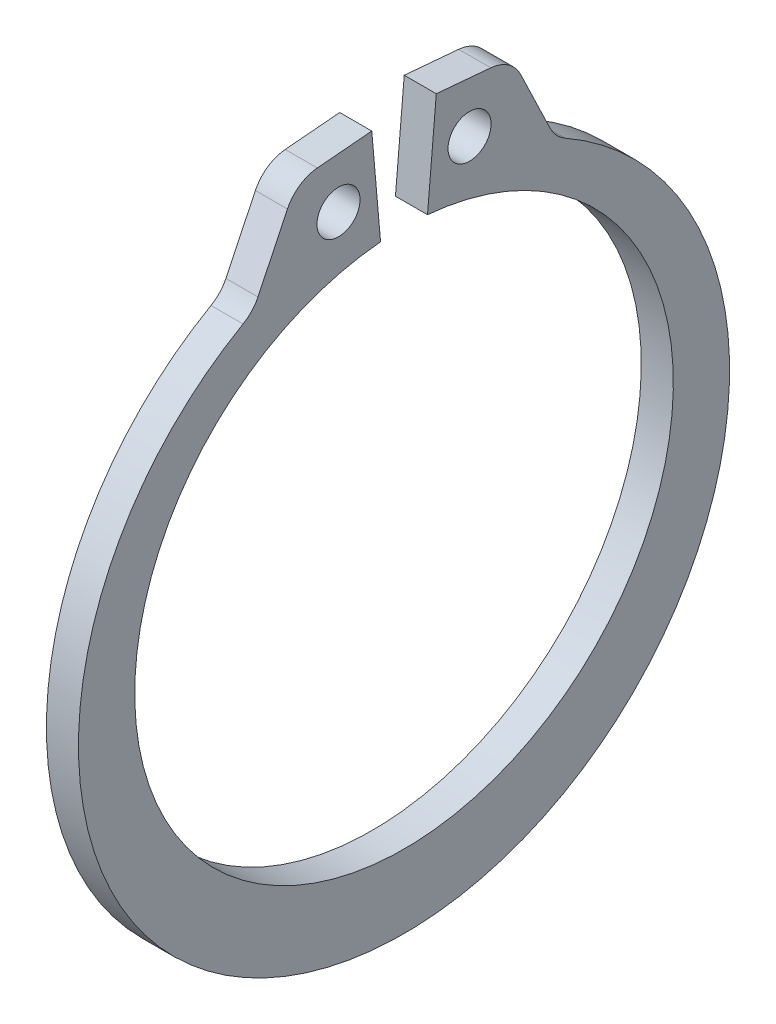
ISO-10303-21;
HEADER;
FILE_DESCRIPTION(('STEP AP214'),'2;1');
FILE_NAME('part.step','',(''),(''),'','','');
FILE_SCHEMA(('AUTOMOTIVE_DESIGN { 1 0 10303 214 1 1 1 1 }'));
ENDSEC;
DATA;
#1=APPLICATION_CONTEXT('core data for automotive mechanical design processes');
#2=APPLICATION_PROTOCOL_DEFINITION('international standard','automotive_design',2000,#1);
#3=PRODUCT_CONTEXT('',#1,'mechanical');
#4=PRODUCT('Part','Part','',(#3));
#5=PRODUCT_RELATED_PRODUCT_CATEGORY('part','',(#4));
#6=PRODUCT_DEFINITION_FORMATION('','',#4);
#7=PRODUCT_DEFINITION_CONTEXT('part definition',#1,'design');
#8=PRODUCT_DEFINITION('design','',#6,#7);
#9=PRODUCT_DEFINITION_SHAPE('','',#8);
#10=(LENGTH_UNIT() NAMED_UNIT(*) SI_UNIT(.MILLI.,.METRE.));
#11=(NAMED_UNIT(*) PLANE_ANGLE_UNIT() SI_UNIT($,.RADIAN.));
#12=(NAMED_UNIT(*) SI_UNIT($,.STERADIAN.) SOLID_ANGLE_UNIT());
#13=UNCERTAINTY_MEASURE_WITH_UNIT(LENGTH_MEASURE(1.E-05),#10,'distance_accuracy_value','');
#14=(GEOMETRIC_REPRESENTATION_CONTEXT(3) GLOBAL_UNCERTAINTY_ASSIGNED_CONTEXT((#13)) GLOBAL_UNIT_ASSIGNED_CONTEXT((#10,
#11,#12)) REPRESENTATION_CONTEXT('',''));
#15=CARTESIAN_POINT('',(0.,0.,0.));
#16=DIRECTION('',(0.,0.,1.));
#17=DIRECTION('',(1.,0.,0.));
#18=AXIS2_PLACEMENT_3D('',#15,#16,#17);
#19=CARTESIAN_POINT('',(0.4445,0.,0.));
#20=DIRECTION('',(1.,0.,0.));
#21=DIRECTION('',(0.,0.,-1.));
#22=AXIS2_PLACEMENT_3D('',#19,#20,#21);
#23=PLANE('',#22);
#24=CARTESIAN_POINT('',(0.4445,8.73955009124023,1.81636379208652));
#25=DIRECTION('',(1.,0.,0.));
#26=DIRECTION('',(0.,0.,-1.));
#27=AXIS2_PLACEMENT_3D('',#24,#25,#26);
#28=CIRCLE('',#27,0.5969);
#29=CARTESIAN_POINT('',(0.4445,8.73955009124023,1.21946379208652));
#30=VERTEX_POINT('',#29);
#31=EDGE_CURVE('E221',#30,#30,#28,.T.);
#32=ORIENTED_EDGE('',*,*,#31,.F.);
#33=EDGE_LOOP('',(#32));
#34=FACE_BOUND('',#33,.T.);
#35=DIRECTION('',(0.,-0.0871557427476592,0.996194698091746));
#36=VECTOR('',#35,1.);
#37=CARTESIAN_POINT('',(0.4445,10.2225515139383,0.894357369779371));
#38=LINE('',#37,#36);
#39=CARTESIAN_POINT('',(0.4445,10.2225515139383,0.894357369779371));
#40=VERTEX_POINT('',#39);
#41=CARTESIAN_POINT('',(0.4445,10.0903647104024,2.40525944792902));
#42=VERTEX_POINT('',#41);
#43=EDGE_CURVE('E133',#40,#42,#38,.T.);
#44=ORIENTED_EDGE('',*,*,#43,.T.);
#45=CARTESIAN_POINT('',(0.4445,9.07823089714119,2.3167092132974));
#46=DIRECTION('',(1.,0.,0.));
#47=DIRECTION('',(0.,0.,-1.));
#48=AXIS2_PLACEMENT_3D('',#45,#46,#47);
#49=CIRCLE('',#48,1.016);
#50=CARTESIAN_POINT('',(0.4445,9.51816860415807,3.23252077357862));
#51=VERTEX_POINT('',#50);
#52=EDGE_CURVE('E174',#42,#51,#49,.T.);
#53=ORIENTED_EDGE('',*,*,#52,.T.);
#54=DIRECTION('',(0.,-0.901389330985454,0.433009554150479));
#55=VECTOR('',#54,1.);
#56=CARTESIAN_POINT('',(0.4445,10.0399166550105,2.98188335963062));
#57=LINE('',#56,#55);
#58=CARTESIAN_POINT('',(0.4445,7.81601834853871,4.05019999158875));
#59=VERTEX_POINT('',#58);
#60=EDGE_CURVE('E213',#51,#59,#57,.T.);
#61=ORIENTED_EDGE('',*,*,#60,.T.);
#62=CARTESIAN_POINT('',(0.4445,8.2559560555556,4.96601155186998));
#63=DIRECTION('',(1.,0.,0.));
#64=DIRECTION('',(0.,0.,-1.));
#65=AXIS2_PLACEMENT_3D('',#62,#63,#64);
#66=CIRCLE('',#65,1.016);
#67=CARTESIAN_POINT('',(0.4445,7.37286685370435,4.46360786799244));
#68=VERTEX_POINT('',#67);
#69=EDGE_CURVE('E181',#59,#68,#66,.F.);
#70=ORIENTED_EDGE('',*,*,#69,.T.);
#71=CARTESIAN_POINT('',(0.4445,-0.472943270735776,0.));
#72=DIRECTION('',(1.,0.,0.));
#73=DIRECTION('',(0.,0.,-1.));
#74=AXIS2_PLACEMENT_3D('',#71,#72,#73);
#75=CIRCLE('',#74,9.02665672926423);
#76=CARTESIAN_POINT('',(0.4445,7.37286685370435,-4.46360786799244));
#77=VERTEX_POINT('',#76);
#78=EDGE_CURVE('E206',#68,#77,#75,.T.);
#79=ORIENTED_EDGE('',*,*,#78,.T.);
#80=CARTESIAN_POINT('',(0.4445,8.2559560555556,-4.96601155186998));
#81=DIRECTION('',(1.,0.,0.));
#82=DIRECTION('',(0.,0.,-1.));
#83=AXIS2_PLACEMENT_3D('',#80,#81,#82);
#84=CIRCLE('',#83,1.016);
#85=CARTESIAN_POINT('',(0.4445,7.81601834853871,-4.05019999158875));
#86=VERTEX_POINT('',#85);
#87=EDGE_CURVE('E11',#77,#86,#84,.F.);
#88=ORIENTED_EDGE('',*,*,#87,.T.);
#89=DIRECTION('',(0.,0.901389330985454,0.433009554150479));
#90=VECTOR('',#89,1.);
#91=CARTESIAN_POINT('',(0.4445,10.0399166550105,-2.98188335963062));
#92=LINE('',#91,#90);
#93=CARTESIAN_POINT('',(0.4445,9.51816860415807,-3.23252077357862));
#94=VERTEX_POINT('',#93);
#95=EDGE_CURVE('E205',#86,#94,#92,.T.);
#96=ORIENTED_EDGE('',*,*,#95,.T.);
#97=CARTESIAN_POINT('',(0.4445,9.07823089714119,-2.3167092132974));
#98=DIRECTION('',(1.,0.,0.));
#99=DIRECTION('',(0.,0.,-1.));
#100=AXIS2_PLACEMENT_3D('',#97,#98,#99);
#101=CIRCLE('',#100,1.016);
#102=CARTESIAN_POINT('',(0.4445,10.0903647104024,-2.40525944792902));
#103=VERTEX_POINT('',#102);
#104=EDGE_CURVE('E49',#94,#103,#101,.T.);
#105=ORIENTED_EDGE('',*,*,#104,.T.);
#106=DIRECTION('',(0.,0.0871557427476592,0.996194698091746));
#107=VECTOR('',#106,1.);
#108=CARTESIAN_POINT('',(0.4445,10.2225515139383,-0.894357369779371));
#109=LINE('',#108,#107);
#110=CARTESIAN_POINT('',(0.4445,10.2225515139383,-0.894357369779371));
#111=VERTEX_POINT('',#110);
#112=EDGE_CURVE('E210',#103,#111,#109,.T.);
#113=ORIENTED_EDGE('',*,*,#112,.T.);
#114=DIRECTION('',(0.,-0.996194698091746,0.0871557427476584));
#115=VECTOR('',#114,1.);
#116=CARTESIAN_POINT('',(0.4445,7.43918352746992,-0.650844224542414));
#117=LINE('',#116,#115);
#118=CARTESIAN_POINT('',(0.4445,7.43918352746992,-0.650844224542414));
#119=VERTEX_POINT('',#118);
#120=EDGE_CURVE('E139',#111,#119,#117,.T.);
#121=ORIENTED_EDGE('',*,*,#120,.T.);
#122=CARTESIAN_POINT('',(0.4445,0.,0.));
#123=DIRECTION('',(-1.,0.,0.));
#124=DIRECTION('',(0.,0.,-1.));
#125=AXIS2_PLACEMENT_3D('',#122,#123,#124);
#126=CIRCLE('',#125,7.4676);
#127=CARTESIAN_POINT('',(0.4445,7.43918352746992,0.650844224542414));
#128=VERTEX_POINT('',#127);
#129=EDGE_CURVE('E134',#119,#128,#126,.T.);
#130=ORIENTED_EDGE('',*,*,#129,.T.);
#131=DIRECTION('',(0.,0.996194698091746,0.0871557427476584));
#132=VECTOR('',#131,1.);
#133=CARTESIAN_POINT('',(0.4445,7.43918352746992,0.650844224542414));
#134=LINE('',#133,#132);
#135=EDGE_CURVE('E125',#128,#40,#134,.T.);
#136=ORIENTED_EDGE('',*,*,#135,.T.);
#137=EDGE_LOOP('',(#44,#53,#61,#70,#79,#88,#96,#105,#113,#121,#130,#136));
#138=FACE_BOUND('',#137,.T.);
#139=CARTESIAN_POINT('',(0.4445,8.73955009124023,-1.81636379208652));
#140=DIRECTION('',(1.,0.,0.));
#141=DIRECTION('',(0.,0.,-1.));
#142=AXIS2_PLACEMENT_3D('',#139,#140,#141);
#143=CIRCLE('',#142,0.5969);
#144=CARTESIAN_POINT('',(0.4445,8.73955009124023,-2.41326379208652));
#145=VERTEX_POINT('',#144);
#146=EDGE_CURVE('E247',#145,#145,#143,.T.);
#147=ORIENTED_EDGE('',*,*,#146,.F.);
#148=EDGE_LOOP('',(#147));
#149=FACE_BOUND('',#148,.T.);
#150=ADVANCED_FACE('F34',(#34,#138,#149),#23,.T.);
#151=CARTESIAN_POINT('',(-0.4445,0.,0.));
#152=DIRECTION('',(1.,0.,0.));
#153=DIRECTION('',(0.,0.,-1.));
#154=AXIS2_PLACEMENT_3D('',#151,#152,#153);
#155=PLANE('',#154);
#156=DIRECTION('',(0.,-0.901389330985454,0.433009554150479));
#157=VECTOR('',#156,1.);
#158=CARTESIAN_POINT('',(-0.4445,10.0399166550105,2.98188335963062));
#159=LINE('',#158,#157);
#160=CARTESIAN_POINT('',(-0.4445,9.51816860415807,3.23252077357862));
#161=VERTEX_POINT('',#160);
#162=CARTESIAN_POINT('',(-0.4445,7.81601834853871,4.05019999158875));
#163=VERTEX_POINT('',#162);
#164=EDGE_CURVE('E200',#161,#163,#159,.T.);
#165=ORIENTED_EDGE('',*,*,#164,.F.);
#166=CARTESIAN_POINT('',(-0.4445,9.07823089714119,2.3167092132974));
#167=DIRECTION('',(1.,0.,0.));
#168=DIRECTION('',(0.,0.,-1.));
#169=AXIS2_PLACEMENT_3D('',#166,#167,#168);
#170=CIRCLE('',#169,1.016);
#171=CARTESIAN_POINT('',(-0.4445,10.0903647104024,2.40525944792902));
#172=VERTEX_POINT('',#171);
#173=EDGE_CURVE('E170',#161,#172,#170,.F.);
#174=ORIENTED_EDGE('',*,*,#173,.T.);
#175=DIRECTION('',(0.,-0.0871557427476592,0.996194698091746));
#176=VECTOR('',#175,1.);
#177=CARTESIAN_POINT('',(-0.4445,10.2225515139383,0.894357369779371));
#178=LINE('',#177,#176);
#179=CARTESIAN_POINT('',(-0.4445,10.2225515139383,0.894357369779371));
#180=VERTEX_POINT('',#179);
#181=EDGE_CURVE('E223',#180,#172,#178,.T.);
#182=ORIENTED_EDGE('',*,*,#181,.F.);
#183=DIRECTION('',(0.,0.996194698091746,0.0871557427476584));
#184=VECTOR('',#183,1.);
#185=CARTESIAN_POINT('',(-0.4445,7.43918352746992,0.650844224542414));
#186=LINE('',#185,#184);
#187=CARTESIAN_POINT('',(-0.4445,7.43918352746992,0.650844224542414));
#188=VERTEX_POINT('',#187);
#189=EDGE_CURVE('E220',#188,#180,#186,.T.);
#190=ORIENTED_EDGE('',*,*,#189,.F.);
#191=CARTESIAN_POINT('',(-0.4445,0.,0.));
#192=DIRECTION('',(-1.,0.,0.));
#193=DIRECTION('',(0.,0.,-1.));
#194=AXIS2_PLACEMENT_3D('',#191,#192,#193);
#195=CIRCLE('',#194,7.4676);
#196=CARTESIAN_POINT('',(-0.4445,7.43918352746992,-0.650844224542414));
#197=VERTEX_POINT('',#196);
#198=EDGE_CURVE('E147',#197,#188,#195,.T.);
#199=ORIENTED_EDGE('',*,*,#198,.F.);
#200=DIRECTION('',(0.,-0.996194698091746,0.0871557427476584));
#201=VECTOR('',#200,1.);
#202=CARTESIAN_POINT('',(-0.4445,7.43918352746992,-0.650844224542414));
#203=LINE('',#202,#201);
#204=CARTESIAN_POINT('',(-0.4445,10.2225515139383,-0.894357369779371));
#205=VERTEX_POINT('',#204);
#206=EDGE_CURVE('E143',#205,#197,#203,.T.);
#207=ORIENTED_EDGE('',*,*,#206,.F.);
#208=DIRECTION('',(0.,0.0871557427476592,0.996194698091746));
#209=VECTOR('',#208,1.);
#210=CARTESIAN_POINT('',(-0.4445,10.2225515139383,-0.894357369779371));
#211=LINE('',#210,#209);
#212=CARTESIAN_POINT('',(-0.4445,10.0903647104024,-2.40525944792902));
#213=VERTEX_POINT('',#212);
#214=EDGE_CURVE('E228',#213,#205,#211,.T.);
#215=ORIENTED_EDGE('',*,*,#214,.F.);
#216=CARTESIAN_POINT('',(-0.4445,9.07823089714119,-2.3167092132974));
#217=DIRECTION('',(1.,0.,0.));
#218=DIRECTION('',(0.,0.,-1.));
#219=AXIS2_PLACEMENT_3D('',#216,#217,#218);
#220=CIRCLE('',#219,1.016);
#221=CARTESIAN_POINT('',(-0.4445,9.51816860415807,-3.23252077357862));
#222=VERTEX_POINT('',#221);
#223=EDGE_CURVE('E168',#213,#222,#220,.F.);
#224=ORIENTED_EDGE('',*,*,#223,.T.);
#225=DIRECTION('',(0.,0.901389330985454,0.433009554150479));
#226=VECTOR('',#225,1.);
#227=CARTESIAN_POINT('',(-0.4445,10.0399166550105,-2.98188335963062));
#228=LINE('',#227,#226);
#229=CARTESIAN_POINT('',(-0.4445,7.81601834853871,-4.05019999158875));
#230=VERTEX_POINT('',#229);
#231=EDGE_CURVE('E191',#230,#222,#228,.T.);
#232=ORIENTED_EDGE('',*,*,#231,.F.);
#233=CARTESIAN_POINT('',(-0.4445,8.2559560555556,-4.96601155186998));
#234=DIRECTION('',(1.,0.,0.));
#235=DIRECTION('',(0.,0.,-1.));
#236=AXIS2_PLACEMENT_3D('',#233,#234,#235);
#237=CIRCLE('',#236,1.016);
#238=CARTESIAN_POINT('',(-0.4445,7.37286685370435,-4.46360786799244));
#239=VERTEX_POINT('',#238);
#240=EDGE_CURVE('E42',#230,#239,#237,.T.);
#241=ORIENTED_EDGE('',*,*,#240,.T.);
#242=CARTESIAN_POINT('',(-0.4445,-0.472943270735776,0.));
#243=DIRECTION('',(1.,0.,0.));
#244=DIRECTION('',(0.,0.,-1.));
#245=AXIS2_PLACEMENT_3D('',#242,#243,#244);
#246=CIRCLE('',#245,9.02665672926423);
#247=CARTESIAN_POINT('',(-0.4445,7.37286685370435,4.46360786799244));
#248=VERTEX_POINT('',#247);
#249=EDGE_CURVE('E189',#248,#239,#246,.T.);
#250=ORIENTED_EDGE('',*,*,#249,.F.);
#251=CARTESIAN_POINT('',(-0.4445,8.2559560555556,4.96601155186998));
#252=DIRECTION('',(1.,0.,0.));
#253=DIRECTION('',(0.,0.,-1.));
#254=AXIS2_PLACEMENT_3D('',#251,#252,#253);
#255=CIRCLE('',#254,1.016);
#256=EDGE_CURVE('E179',#248,#163,#255,.T.);
#257=ORIENTED_EDGE('',*,*,#256,.T.);
#258=EDGE_LOOP('',(#165,#174,#182,#190,#199,#207,#215,#224,#232,#241,#250,#257));
#259=FACE_BOUND('',#258,.T.);
#260=CARTESIAN_POINT('',(-0.4445,8.73955009124023,1.81636379208652));
#261=DIRECTION('',(1.,0.,0.));
#262=DIRECTION('',(0.,0.,-1.));
#263=AXIS2_PLACEMENT_3D('',#260,#261,#262);
#264=CIRCLE('',#263,0.5969);
#265=CARTESIAN_POINT('',(-0.4445,8.73955009124023,1.21946379208652));
#266=VERTEX_POINT('',#265);
#267=EDGE_CURVE('E244',#266,#266,#264,.T.);
#268=ORIENTED_EDGE('',*,*,#267,.T.);
#269=EDGE_LOOP('',(#268));
#270=FACE_BOUND('',#269,.T.);
#271=CARTESIAN_POINT('',(-0.4445,8.73955009124023,-1.81636379208652));
#272=DIRECTION('',(1.,0.,0.));
#273=DIRECTION('',(0.,0.,-1.));
#274=AXIS2_PLACEMENT_3D('',#271,#272,#273);
#275=CIRCLE('',#274,0.5969);
#276=CARTESIAN_POINT('',(-0.4445,8.73955009124023,-2.41326379208652));
#277=VERTEX_POINT('',#276);
#278=EDGE_CURVE('E250',#277,#277,#275,.T.);
#279=ORIENTED_EDGE('',*,*,#278,.T.);
#280=EDGE_LOOP('',(#279));
#281=FACE_BOUND('',#280,.T.);
#282=ADVANCED_FACE('F187',(#259,#270,#281),#155,.F.);
#283=CARTESIAN_POINT('',(0.4445,0.,0.));
#284=DIRECTION('',(-1.,0.,0.));
#285=DIRECTION('',(0.,0.,1.));
#286=AXIS2_PLACEMENT_3D('',#283,#284,#285);
#287=CYLINDRICAL_SURFACE('',#286,7.4676);
#288=ORIENTED_EDGE('',*,*,#198,.T.);
#289=DIRECTION('',(-1.,0.,0.));
#290=VECTOR('',#289,1.);
#291=CARTESIAN_POINT('',(0.4445,7.43918352746992,0.650844224542414));
#292=LINE('',#291,#290);
#293=EDGE_CURVE('E129',#128,#188,#292,.T.);
#294=ORIENTED_EDGE('',*,*,#293,.F.);
#295=ORIENTED_EDGE('',*,*,#129,.F.);
#296=DIRECTION('',(-1.,0.,0.));
#297=VECTOR('',#296,1.);
#298=CARTESIAN_POINT('',(0.4445,7.43918352746992,-0.650844224542414));
#299=LINE('',#298,#297);
#300=EDGE_CURVE('E218',#119,#197,#299,.T.);
#301=ORIENTED_EDGE('',*,*,#300,.T.);
#302=EDGE_LOOP('',(#288,#294,#295,#301));
#303=FACE_BOUND('',#302,.T.);
#304=ADVANCED_FACE('F145',(#303),#287,.F.);
#305=CARTESIAN_POINT('',(0.4445,7.43918352746992,0.650844224542414));
#306=DIRECTION('',(0.,-0.0871557427476584,0.996194698091746));
#307=DIRECTION('',(0.,-0.996194698091746,-0.0871557427476584));
#308=AXIS2_PLACEMENT_3D('',#305,#306,#307);
#309=PLANE('',#308);
#310=ORIENTED_EDGE('',*,*,#189,.T.);
#311=DIRECTION('',(-1.,0.,0.));
#312=VECTOR('',#311,1.);
#313=CARTESIAN_POINT('',(0.4445,10.2225515139383,0.894357369779371));
#314=LINE('',#313,#312);
#315=EDGE_CURVE('E132',#40,#180,#314,.T.);
#316=ORIENTED_EDGE('',*,*,#315,.F.);
#317=ORIENTED_EDGE('',*,*,#135,.F.);
#318=ORIENTED_EDGE('',*,*,#293,.T.);
#319=EDGE_LOOP('',(#310,#316,#317,#318));
#320=FACE_BOUND('',#319,.T.);
#321=ADVANCED_FACE('F127',(#320),#309,.F.);
#322=CARTESIAN_POINT('',(0.4445,10.2225515139383,0.894357369779371));
#323=DIRECTION('',(0.,-0.996194698091746,-0.0871557427476592));
#324=DIRECTION('',(0.,0.0871557427476592,-0.996194698091746));
#325=AXIS2_PLACEMENT_3D('',#322,#323,#324);
#326=PLANE('',#325);
#327=ORIENTED_EDGE('',*,*,#181,.T.);
#328=DIRECTION('',(-1.,0.,0.));
#329=VECTOR('',#328,1.);
#330=CARTESIAN_POINT('',(0.4445,10.0903647104024,2.40525944792902));
#331=LINE('',#330,#329);
#332=EDGE_CURVE('E57',#172,#42,#331,.F.);
#333=ORIENTED_EDGE('',*,*,#332,.T.);
#334=ORIENTED_EDGE('',*,*,#43,.F.);
#335=ORIENTED_EDGE('',*,*,#315,.T.);
#336=EDGE_LOOP('',(#327,#333,#334,#335));
#337=FACE_BOUND('',#336,.T.);
#338=ADVANCED_FACE('F239',(#337),#326,.F.);
#339=CARTESIAN_POINT('',(0.4445,10.0399166550105,2.98188335963062));
#340=DIRECTION('',(0.,-0.433009554150479,-0.901389330985454));
#341=DIRECTION('',(0.,0.901389330985454,-0.433009554150479));
#342=AXIS2_PLACEMENT_3D('',#339,#340,#341);
#343=PLANE('',#342);
#344=ORIENTED_EDGE('',*,*,#164,.T.);
#345=DIRECTION('',(1.,0.,0.));
#346=VECTOR('',#345,1.);
#347=CARTESIAN_POINT('',(0.4445,7.81601834853871,4.05019999158875));
#348=LINE('',#347,#346);
#349=EDGE_CURVE('E161',#163,#59,#348,.T.);
#350=ORIENTED_EDGE('',*,*,#349,.T.);
#351=ORIENTED_EDGE('',*,*,#60,.F.);
#352=DIRECTION('',(-1.,0.,0.));
#353=VECTOR('',#352,1.);
#354=CARTESIAN_POINT('',(0.4445,9.51816860415807,3.23252077357862));
#355=LINE('',#354,#353);
#356=EDGE_CURVE('E158',#51,#161,#355,.T.);
#357=ORIENTED_EDGE('',*,*,#356,.T.);
#358=EDGE_LOOP('',(#344,#350,#351,#357));
#359=FACE_BOUND('',#358,.T.);
#360=ADVANCED_FACE('F279',(#359),#343,.F.);
#361=CARTESIAN_POINT('',(0.4445,-0.472943270735776,0.));
#362=DIRECTION('',(-1.,0.,0.));
#363=DIRECTION('',(0.,0.,1.));
#364=AXIS2_PLACEMENT_3D('',#361,#362,#363);
#365=CYLINDRICAL_SURFACE('',#364,9.02665672926423);
#366=ORIENTED_EDGE('',*,*,#78,.F.);
#367=DIRECTION('',(-1.,0.,0.));
#368=VECTOR('',#367,1.);
#369=CARTESIAN_POINT('',(0.4445,7.37286685370435,4.46360786799244));
#370=LINE('',#369,#368);
#371=EDGE_CURVE('E150',#68,#248,#370,.T.);
#372=ORIENTED_EDGE('',*,*,#371,.T.);
#373=ORIENTED_EDGE('',*,*,#249,.T.);
#374=DIRECTION('',(-1.,0.,0.));
#375=VECTOR('',#374,1.);
#376=CARTESIAN_POINT('',(0.4445,7.37286685370435,-4.46360786799244));
#377=LINE('',#376,#375);
#378=EDGE_CURVE('E148',#239,#77,#377,.F.);
#379=ORIENTED_EDGE('',*,*,#378,.T.);
#380=EDGE_LOOP('',(#366,#372,#373,#379));
#381=FACE_BOUND('',#380,.T.);
#382=ADVANCED_FACE('F197',(#381),#365,.T.);
#383=CARTESIAN_POINT('',(0.4445,10.0399166550105,-2.98188335963062));
#384=DIRECTION('',(0.,-0.433009554150479,0.901389330985454));
#385=DIRECTION('',(0.,-0.901389330985454,-0.433009554150479));
#386=AXIS2_PLACEMENT_3D('',#383,#384,#385);
#387=PLANE('',#386);
#388=ORIENTED_EDGE('',*,*,#95,.F.);
#389=DIRECTION('',(1.,0.,0.));
#390=VECTOR('',#389,1.);
#391=CARTESIAN_POINT('',(-0.4445,7.81601834853871,-4.05019999158875));
#392=LINE('',#391,#390);
#393=EDGE_CURVE('E165',#86,#230,#392,.F.);
#394=ORIENTED_EDGE('',*,*,#393,.T.);
#395=ORIENTED_EDGE('',*,*,#231,.T.);
#396=DIRECTION('',(-1.,0.,0.));
#397=VECTOR('',#396,1.);
#398=CARTESIAN_POINT('',(0.4445,9.51816860415807,-3.23252077357862));
#399=LINE('',#398,#397);
#400=EDGE_CURVE('E163',#222,#94,#399,.F.);
#401=ORIENTED_EDGE('',*,*,#400,.T.);
#402=EDGE_LOOP('',(#388,#394,#395,#401));
#403=FACE_BOUND('',#402,.T.);
#404=ADVANCED_FACE('F208',(#403),#387,.F.);
#405=CARTESIAN_POINT('',(0.4445,10.2225515139383,-0.894357369779371));
#406=DIRECTION('',(0.,-0.996194698091746,0.0871557427476592));
#407=DIRECTION('',(0.,-0.0871557427476592,-0.996194698091746));
#408=AXIS2_PLACEMENT_3D('',#405,#406,#407);
#409=PLANE('',#408);
#410=ORIENTED_EDGE('',*,*,#112,.F.);
#411=DIRECTION('',(-1.,0.,0.));
#412=VECTOR('',#411,1.);
#413=CARTESIAN_POINT('',(0.4445,10.0903647104024,-2.40525944792902));
#414=LINE('',#413,#412);
#415=EDGE_CURVE('E176',#103,#213,#414,.T.);
#416=ORIENTED_EDGE('',*,*,#415,.T.);
#417=ORIENTED_EDGE('',*,*,#214,.T.);
#418=DIRECTION('',(-1.,0.,0.));
#419=VECTOR('',#418,1.);
#420=CARTESIAN_POINT('',(0.4445,10.2225515139383,-0.894357369779371));
#421=LINE('',#420,#419);
#422=EDGE_CURVE('E152',#111,#205,#421,.T.);
#423=ORIENTED_EDGE('',*,*,#422,.F.);
#424=EDGE_LOOP('',(#410,#416,#417,#423));
#425=FACE_BOUND('',#424,.T.);
#426=ADVANCED_FACE('F272',(#425),#409,.F.);
#427=CARTESIAN_POINT('',(0.4445,7.43918352746992,-0.650844224542414));
#428=DIRECTION('',(0.,-0.0871557427476584,-0.996194698091746));
#429=DIRECTION('',(0.,0.996194698091746,-0.0871557427476584));
#430=AXIS2_PLACEMENT_3D('',#427,#428,#429);
#431=PLANE('',#430);
#432=ORIENTED_EDGE('',*,*,#206,.T.);
#433=ORIENTED_EDGE('',*,*,#300,.F.);
#434=ORIENTED_EDGE('',*,*,#120,.F.);
#435=ORIENTED_EDGE('',*,*,#422,.T.);
#436=EDGE_LOOP('',(#432,#433,#434,#435));
#437=FACE_BOUND('',#436,.T.);
#438=ADVANCED_FACE('F235',(#437),#431,.F.);
#439=CARTESIAN_POINT('',(0.4445,8.73955009124023,1.81636379208652));
#440=DIRECTION('',(-1.,0.,0.));
#441=DIRECTION('',(0.,0.,1.));
#442=AXIS2_PLACEMENT_3D('',#439,#440,#441);
#443=CYLINDRICAL_SURFACE('',#442,0.5969);
#444=ORIENTED_EDGE('',*,*,#31,.T.);
#445=EDGE_LOOP('',(#444));
#446=FACE_BOUND('',#445,.T.);
#447=ORIENTED_EDGE('',*,*,#267,.F.);
#448=EDGE_LOOP('',(#447));
#449=FACE_BOUND('',#448,.T.);
#450=ADVANCED_FACE('F267',(#446,#449),#443,.F.);
#451=CARTESIAN_POINT('',(0.4445,8.73955009124023,-1.81636379208652));
#452=DIRECTION('',(-1.,0.,0.));
#453=DIRECTION('',(0.,0.,1.));
#454=AXIS2_PLACEMENT_3D('',#451,#452,#453);
#455=CYLINDRICAL_SURFACE('',#454,0.5969);
#456=ORIENTED_EDGE('',*,*,#146,.T.);
#457=EDGE_LOOP('',(#456));
#458=FACE_BOUND('',#457,.T.);
#459=ORIENTED_EDGE('',*,*,#278,.F.);
#460=EDGE_LOOP('',(#459));
#461=FACE_BOUND('',#460,.T.);
#462=ADVANCED_FACE('F256',(#458,#461),#455,.F.);
#463=CARTESIAN_POINT('',(0.4445,8.2559560555556,4.96601155186998));
#464=DIRECTION('',(-1.,0.,0.));
#465=DIRECTION('',(0.,0.,1.));
#466=AXIS2_PLACEMENT_3D('',#463,#464,#465);
#467=CYLINDRICAL_SURFACE('',#466,1.016);
#468=ORIENTED_EDGE('',*,*,#69,.F.);
#469=ORIENTED_EDGE('',*,*,#349,.F.);
#470=ORIENTED_EDGE('',*,*,#256,.F.);
#471=ORIENTED_EDGE('',*,*,#371,.F.);
#472=EDGE_LOOP('',(#468,#469,#470,#471));
#473=FACE_BOUND('',#472,.T.);
#474=ADVANCED_FACE('F289',(#473),#467,.F.);
#475=CARTESIAN_POINT('',(0.4445,8.2559560555556,-4.96601155186998));
#476=DIRECTION('',(-1.,0.,0.));
#477=DIRECTION('',(0.,0.,1.));
#478=AXIS2_PLACEMENT_3D('',#475,#476,#477);
#479=CYLINDRICAL_SURFACE('',#478,1.016);
#480=ORIENTED_EDGE('',*,*,#87,.F.);
#481=ORIENTED_EDGE('',*,*,#378,.F.);
#482=ORIENTED_EDGE('',*,*,#240,.F.);
#483=ORIENTED_EDGE('',*,*,#393,.F.);
#484=EDGE_LOOP('',(#480,#481,#482,#483));
#485=FACE_BOUND('',#484,.T.);
#486=ADVANCED_FACE('F203',(#485),#479,.F.);
#487=CARTESIAN_POINT('',(0.4445,9.07823089714119,2.3167092132974));
#488=DIRECTION('',(-1.,0.,0.));
#489=DIRECTION('',(0.,0.,1.));
#490=AXIS2_PLACEMENT_3D('',#487,#488,#489);
#491=CYLINDRICAL_SURFACE('',#490,1.016);
#492=ORIENTED_EDGE('',*,*,#52,.F.);
#493=ORIENTED_EDGE('',*,*,#332,.F.);
#494=ORIENTED_EDGE('',*,*,#173,.F.);
#495=ORIENTED_EDGE('',*,*,#356,.F.);
#496=EDGE_LOOP('',(#492,#493,#494,#495));
#497=FACE_BOUND('',#496,.T.);
#498=ADVANCED_FACE('F294',(#497),#491,.T.);
#499=CARTESIAN_POINT('',(0.4445,9.07823089714119,-2.3167092132974));
#500=DIRECTION('',(-1.,0.,0.));
#501=DIRECTION('',(0.,0.,1.));
#502=AXIS2_PLACEMENT_3D('',#499,#500,#501);
#503=CYLINDRICAL_SURFACE('',#502,1.016);
#504=ORIENTED_EDGE('',*,*,#104,.F.);
#505=ORIENTED_EDGE('',*,*,#400,.F.);
#506=ORIENTED_EDGE('',*,*,#223,.F.);
#507=ORIENTED_EDGE('',*,*,#415,.F.);
#508=EDGE_LOOP('',(#504,#505,#506,#507));
#509=FACE_BOUND('',#508,.T.);
#510=ADVANCED_FACE('F36',(#509),#503,.T.);
#511=CLOSED_SHELL('',(#150,#282,#304,#321,#338,#360,#382,#404,#426,#438,#450,#462,#474,#486,
#498,#510));
#512=MANIFOLD_SOLID_BREP('B2',#511);
#513=ADVANCED_BREP_SHAPE_REPRESENTATION('',(#18,#512),#14);
#514=SHAPE_DEFINITION_REPRESENTATION(#9,#513);
ENDSEC;
END-ISO-10303-21;
